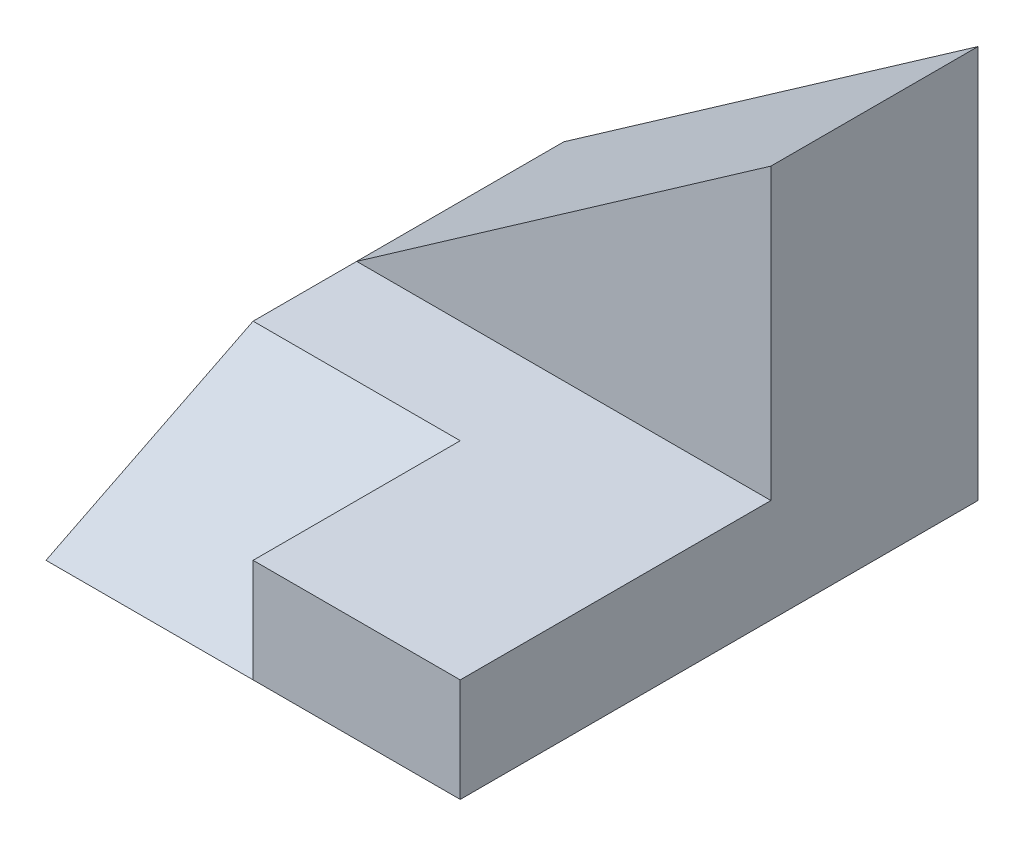
ISO-10303-21;
HEADER;
FILE_DESCRIPTION(('STEP AP214'),'2;1');
FILE_NAME('part.step','',(''),(''),'','','');
FILE_SCHEMA(('AUTOMOTIVE_DESIGN { 1 0 10303 214 1 1 1 1 }'));
ENDSEC;
DATA;
#1=APPLICATION_CONTEXT('core data for automotive mechanical design processes');
#2=APPLICATION_PROTOCOL_DEFINITION('international standard','automotive_design',2000,#1);
#3=PRODUCT_CONTEXT('',#1,'mechanical');
#4=PRODUCT('Part','Part','',(#3));
#5=PRODUCT_RELATED_PRODUCT_CATEGORY('part','',(#4));
#6=PRODUCT_DEFINITION_FORMATION('','',#4);
#7=PRODUCT_DEFINITION_CONTEXT('part definition',#1,'design');
#8=PRODUCT_DEFINITION('design','',#6,#7);
#9=PRODUCT_DEFINITION_SHAPE('','',#8);
#10=(LENGTH_UNIT() NAMED_UNIT(*) SI_UNIT(.MILLI.,.METRE.));
#11=(NAMED_UNIT(*) PLANE_ANGLE_UNIT() SI_UNIT($,.RADIAN.));
#12=(NAMED_UNIT(*) SI_UNIT($,.STERADIAN.) SOLID_ANGLE_UNIT());
#13=UNCERTAINTY_MEASURE_WITH_UNIT(LENGTH_MEASURE(1.E-05),#10,'distance_accuracy_value','');
#14=(GEOMETRIC_REPRESENTATION_CONTEXT(3) GLOBAL_UNCERTAINTY_ASSIGNED_CONTEXT((#13)) GLOBAL_UNIT_ASSIGNED_CONTEXT((#10,
#11,#12)) REPRESENTATION_CONTEXT('',''));
#15=CARTESIAN_POINT('',(0.,0.,0.));
#16=DIRECTION('',(0.,0.,1.));
#17=DIRECTION('',(1.,0.,0.));
#18=AXIS2_PLACEMENT_3D('',#15,#16,#17);
#19=CARTESIAN_POINT('',(0.,0.,50.));
#20=DIRECTION('',(0.,0.,1.));
#21=DIRECTION('',(1.,0.,0.));
#22=AXIS2_PLACEMENT_3D('',#19,#20,#21);
#23=PLANE('',#22);
#24=DIRECTION('',(-1.,0.,0.));
#25=VECTOR('',#24,1.);
#26=CARTESIAN_POINT('',(0.,10.,50.));
#27=LINE('',#26,#25);
#28=CARTESIAN_POINT('',(40.,10.,50.));
#29=VERTEX_POINT('',#28);
#30=CARTESIAN_POINT('',(20.,10.,50.));
#31=VERTEX_POINT('',#30);
#32=EDGE_CURVE('E113',#29,#31,#27,.T.);
#33=ORIENTED_EDGE('',*,*,#32,.T.);
#34=DIRECTION('',(0.,1.,0.));
#35=VECTOR('',#34,1.);
#36=CARTESIAN_POINT('',(20.,0.,50.));
#37=LINE('',#36,#35);
#38=CARTESIAN_POINT('',(20.,0.,50.));
#39=VERTEX_POINT('',#38);
#40=EDGE_CURVE('E98',#39,#31,#37,.T.);
#41=ORIENTED_EDGE('',*,*,#40,.F.);
#42=DIRECTION('',(1.,0.,0.));
#43=VECTOR('',#42,1.);
#44=CARTESIAN_POINT('',(0.,0.,50.));
#45=LINE('',#44,#43);
#46=CARTESIAN_POINT('',(40.,0.,50.));
#47=VERTEX_POINT('',#46);
#48=EDGE_CURVE('E132',#39,#47,#45,.T.);
#49=ORIENTED_EDGE('',*,*,#48,.T.);
#50=DIRECTION('',(0.,1.,0.));
#51=VECTOR('',#50,1.);
#52=CARTESIAN_POINT('',(40.,10.,50.));
#53=LINE('',#52,#51);
#54=EDGE_CURVE('E118',#47,#29,#53,.T.);
#55=ORIENTED_EDGE('',*,*,#54,.T.);
#56=EDGE_LOOP('',(#33,#41,#49,#55));
#57=FACE_BOUND('',#56,.T.);
#58=ADVANCED_FACE('F39',(#57),#23,.T.);
#59=CARTESIAN_POINT('',(0.,0.,20.));
#60=DIRECTION('',(0.,0.,-1.));
#61=DIRECTION('',(-1.,0.,0.));
#62=AXIS2_PLACEMENT_3D('',#59,#60,#61);
#63=PLANE('',#62);
#64=DIRECTION('',(-1.,0.,0.));
#65=VECTOR('',#64,1.);
#66=CARTESIAN_POINT('',(0.,10.,20.));
#67=LINE('',#66,#65);
#68=CARTESIAN_POINT('',(40.,10.,20.));
#69=VERTEX_POINT('',#68);
#70=CARTESIAN_POINT('',(0.,10.,20.));
#71=VERTEX_POINT('',#70);
#72=EDGE_CURVE('E63',#69,#71,#67,.T.);
#73=ORIENTED_EDGE('',*,*,#72,.F.);
#74=DIRECTION('',(0.,1.,0.));
#75=VECTOR('',#74,1.);
#76=CARTESIAN_POINT('',(40.,0.,20.));
#77=LINE('',#76,#75);
#78=CARTESIAN_POINT('',(40.,37.9669030732861,20.));
#79=VERTEX_POINT('',#78);
#80=EDGE_CURVE('E137',#69,#79,#77,.T.);
#81=ORIENTED_EDGE('',*,*,#80,.T.);
#82=DIRECTION('',(-0.819550371604611,-0.573007145158543,0.));
#83=VECTOR('',#82,1.);
#84=CARTESIAN_POINT('',(0.,10.,20.));
#85=LINE('',#84,#83);
#86=EDGE_CURVE('E140',#79,#71,#85,.T.);
#87=ORIENTED_EDGE('',*,*,#86,.T.);
#88=EDGE_LOOP('',(#73,#81,#87));
#89=FACE_BOUND('',#88,.T.);
#90=ADVANCED_FACE('F184',(#89),#63,.F.);
#91=CARTESIAN_POINT('',(0.,0.,20.));
#92=DIRECTION('',(1.,0.,0.));
#93=DIRECTION('',(0.,0.,-1.));
#94=AXIS2_PLACEMENT_3D('',#91,#92,#93);
#95=PLANE('',#94);
#96=DIRECTION('',(0.,0.,-1.));
#97=VECTOR('',#96,1.);
#98=CARTESIAN_POINT('',(0.,0.,20.));
#99=LINE('',#98,#97);
#100=CARTESIAN_POINT('',(0.,0.,50.));
#101=VERTEX_POINT('',#100);
#102=CARTESIAN_POINT('',(0.,0.,0.));
#103=VERTEX_POINT('',#102);
#104=EDGE_CURVE('E11',#101,#103,#99,.T.);
#105=ORIENTED_EDGE('',*,*,#104,.F.);
#106=DIRECTION('',(0.,-0.447213595499958,0.894427190999916));
#107=VECTOR('',#106,1.);
#108=CARTESIAN_POINT('',(0.,10.,30.));
#109=LINE('',#108,#107);
#110=CARTESIAN_POINT('',(0.,10.,30.));
#111=VERTEX_POINT('',#110);
#112=EDGE_CURVE('E183',#111,#101,#109,.T.);
#113=ORIENTED_EDGE('',*,*,#112,.F.);
#114=DIRECTION('',(0.,0.,-1.));
#115=VECTOR('',#114,1.);
#116=CARTESIAN_POINT('',(0.,10.,50.));
#117=LINE('',#116,#115);
#118=EDGE_CURVE('E121',#111,#71,#117,.T.);
#119=ORIENTED_EDGE('',*,*,#118,.T.);
#120=DIRECTION('',(0.,0.,-1.));
#121=VECTOR('',#120,1.);
#122=CARTESIAN_POINT('',(0.,10.,20.));
#123=LINE('',#122,#121);
#124=CARTESIAN_POINT('',(0.,10.,0.));
#125=VERTEX_POINT('',#124);
#126=EDGE_CURVE('E144',#71,#125,#123,.T.);
#127=ORIENTED_EDGE('',*,*,#126,.T.);
#128=DIRECTION('',(0.,-1.,0.));
#129=VECTOR('',#128,1.);
#130=CARTESIAN_POINT('',(0.,0.,0.));
#131=LINE('',#130,#129);
#132=EDGE_CURVE('E136',#125,#103,#131,.T.);
#133=ORIENTED_EDGE('',*,*,#132,.T.);
#134=EDGE_LOOP('',(#105,#113,#119,#127,#133));
#135=FACE_BOUND('',#134,.T.);
#136=ADVANCED_FACE('F41',(#135),#95,.F.);
#137=CARTESIAN_POINT('',(0.,0.,20.));
#138=DIRECTION('',(0.,1.,0.));
#139=DIRECTION('',(0.,0.,1.));
#140=AXIS2_PLACEMENT_3D('',#137,#138,#139);
#141=PLANE('',#140);
#142=DIRECTION('',(1.,0.,0.));
#143=VECTOR('',#142,1.);
#144=CARTESIAN_POINT('',(0.,0.,0.));
#145=LINE('',#144,#143);
#146=CARTESIAN_POINT('',(40.,0.,0.));
#147=VERTEX_POINT('',#146);
#148=EDGE_CURVE('E148',#103,#147,#145,.T.);
#149=ORIENTED_EDGE('',*,*,#148,.T.);
#150=DIRECTION('',(0.,0.,-1.));
#151=VECTOR('',#150,1.);
#152=CARTESIAN_POINT('',(40.,0.,20.));
#153=LINE('',#152,#151);
#154=EDGE_CURVE('E48',#47,#147,#153,.T.);
#155=ORIENTED_EDGE('',*,*,#154,.F.);
#156=ORIENTED_EDGE('',*,*,#48,.F.);
#157=EDGE_CURVE('E127',#101,#39,#45,.T.);
#158=ORIENTED_EDGE('',*,*,#157,.F.);
#159=ORIENTED_EDGE('',*,*,#104,.T.);
#160=EDGE_LOOP('',(#149,#155,#156,#158,#159));
#161=FACE_BOUND('',#160,.T.);
#162=ADVANCED_FACE('F170',(#161),#141,.F.);
#163=CARTESIAN_POINT('',(40.,37.9669030732861,20.));
#164=DIRECTION('',(-1.,0.,0.));
#165=DIRECTION('',(0.,0.,1.));
#166=AXIS2_PLACEMENT_3D('',#163,#164,#165);
#167=PLANE('',#166);
#168=DIRECTION('',(0.,1.,0.));
#169=VECTOR('',#168,1.);
#170=CARTESIAN_POINT('',(40.,37.9669030732861,0.));
#171=LINE('',#170,#169);
#172=CARTESIAN_POINT('',(40.,37.9669030732861,0.));
#173=VERTEX_POINT('',#172);
#174=EDGE_CURVE('E152',#147,#173,#171,.T.);
#175=ORIENTED_EDGE('',*,*,#174,.T.);
#176=DIRECTION('',(0.,0.,-1.));
#177=VECTOR('',#176,1.);
#178=CARTESIAN_POINT('',(40.,37.9669030732861,20.));
#179=LINE('',#178,#177);
#180=EDGE_CURVE('E160',#79,#173,#179,.T.);
#181=ORIENTED_EDGE('',*,*,#180,.F.);
#182=ORIENTED_EDGE('',*,*,#80,.F.);
#183=DIRECTION('',(0.,0.,-1.));
#184=VECTOR('',#183,1.);
#185=CARTESIAN_POINT('',(40.,10.,50.));
#186=LINE('',#185,#184);
#187=EDGE_CURVE('E125',#29,#69,#186,.T.);
#188=ORIENTED_EDGE('',*,*,#187,.F.);
#189=ORIENTED_EDGE('',*,*,#54,.F.);
#190=ORIENTED_EDGE('',*,*,#154,.T.);
#191=EDGE_LOOP('',(#175,#181,#182,#188,#189,#190));
#192=FACE_BOUND('',#191,.T.);
#193=ADVANCED_FACE('F167',(#192),#167,.F.);
#194=CARTESIAN_POINT('',(0.,10.,20.));
#195=DIRECTION('',(0.573007145158543,-0.819550371604611,0.));
#196=DIRECTION('',(0.819550371604611,0.573007145158543,0.));
#197=AXIS2_PLACEMENT_3D('',#194,#195,#196);
#198=PLANE('',#197);
#199=DIRECTION('',(-0.819550371604611,-0.573007145158543,0.));
#200=VECTOR('',#199,1.);
#201=CARTESIAN_POINT('',(0.,10.,0.));
#202=LINE('',#201,#200);
#203=EDGE_CURVE('E141',#173,#125,#202,.T.);
#204=ORIENTED_EDGE('',*,*,#203,.T.);
#205=ORIENTED_EDGE('',*,*,#126,.F.);
#206=ORIENTED_EDGE('',*,*,#86,.F.);
#207=ORIENTED_EDGE('',*,*,#180,.T.);
#208=EDGE_LOOP('',(#204,#205,#206,#207));
#209=FACE_BOUND('',#208,.T.);
#210=ADVANCED_FACE('F179',(#209),#198,.F.);
#211=CARTESIAN_POINT('',(0.,0.,0.));
#212=DIRECTION('',(0.,0.,-1.));
#213=DIRECTION('',(-1.,0.,0.));
#214=AXIS2_PLACEMENT_3D('',#211,#212,#213);
#215=PLANE('',#214);
#216=ORIENTED_EDGE('',*,*,#132,.F.);
#217=ORIENTED_EDGE('',*,*,#203,.F.);
#218=ORIENTED_EDGE('',*,*,#174,.F.);
#219=ORIENTED_EDGE('',*,*,#148,.F.);
#220=EDGE_LOOP('',(#216,#217,#218,#219));
#221=FACE_BOUND('',#220,.T.);
#222=ADVANCED_FACE('F175',(#221),#215,.T.);
#223=CARTESIAN_POINT('',(0.,10.,50.));
#224=DIRECTION('',(0.,-1.,0.));
#225=DIRECTION('',(0.,0.,-1.));
#226=AXIS2_PLACEMENT_3D('',#223,#224,#225);
#227=PLANE('',#226);
#228=ORIENTED_EDGE('',*,*,#118,.F.);
#229=DIRECTION('',(-1.,0.,0.));
#230=VECTOR('',#229,1.);
#231=CARTESIAN_POINT('',(20.,10.,30.));
#232=LINE('',#231,#230);
#233=CARTESIAN_POINT('',(20.,10.,30.));
#234=VERTEX_POINT('',#233);
#235=EDGE_CURVE('E114',#234,#111,#232,.T.);
#236=ORIENTED_EDGE('',*,*,#235,.F.);
#237=DIRECTION('',(0.,0.,-1.));
#238=VECTOR('',#237,1.);
#239=CARTESIAN_POINT('',(20.,10.,50.));
#240=LINE('',#239,#238);
#241=EDGE_CURVE('E101',#31,#234,#240,.T.);
#242=ORIENTED_EDGE('',*,*,#241,.F.);
#243=ORIENTED_EDGE('',*,*,#32,.F.);
#244=ORIENTED_EDGE('',*,*,#187,.T.);
#245=ORIENTED_EDGE('',*,*,#72,.T.);
#246=EDGE_LOOP('',(#228,#236,#242,#243,#244,#245));
#247=FACE_BOUND('',#246,.T.);
#248=ADVANCED_FACE('F111',(#247),#227,.F.);
#249=CARTESIAN_POINT('',(20.,10.,30.));
#250=DIRECTION('',(0.,-0.894427190999916,-0.447213595499958));
#251=DIRECTION('',(0.,0.447213595499958,-0.894427190999916));
#252=AXIS2_PLACEMENT_3D('',#249,#250,#251);
#253=PLANE('',#252);
#254=ORIENTED_EDGE('',*,*,#112,.T.);
#255=ORIENTED_EDGE('',*,*,#157,.T.);
#256=DIRECTION('',(0.,-0.447213595499958,0.894427190999916));
#257=VECTOR('',#256,1.);
#258=CARTESIAN_POINT('',(20.,10.,30.));
#259=LINE('',#258,#257);
#260=EDGE_CURVE('E55',#234,#39,#259,.T.);
#261=ORIENTED_EDGE('',*,*,#260,.F.);
#262=ORIENTED_EDGE('',*,*,#235,.T.);
#263=EDGE_LOOP('',(#254,#255,#261,#262));
#264=FACE_BOUND('',#263,.T.);
#265=ADVANCED_FACE('F223',(#264),#253,.F.);
#266=CARTESIAN_POINT('',(20.,0.,0.));
#267=DIRECTION('',(-1.,0.,0.));
#268=DIRECTION('',(0.,0.,1.));
#269=AXIS2_PLACEMENT_3D('',#266,#267,#268);
#270=PLANE('',#269);
#271=ORIENTED_EDGE('',*,*,#260,.T.);
#272=ORIENTED_EDGE('',*,*,#40,.T.);
#273=ORIENTED_EDGE('',*,*,#241,.T.);
#274=EDGE_LOOP('',(#271,#272,#273));
#275=FACE_BOUND('',#274,.T.);
#276=ADVANCED_FACE('F100',(#275),#270,.T.);
#277=CLOSED_SHELL('',(#58,#90,#136,#162,#193,#210,#222,#248,#265,#276));
#278=MANIFOLD_SOLID_BREP('B2',#277);
#279=ADVANCED_BREP_SHAPE_REPRESENTATION('',(#18,#278),#14);
#280=SHAPE_DEFINITION_REPRESENTATION(#9,#279);
ENDSEC;
END-ISO-10303-21;
